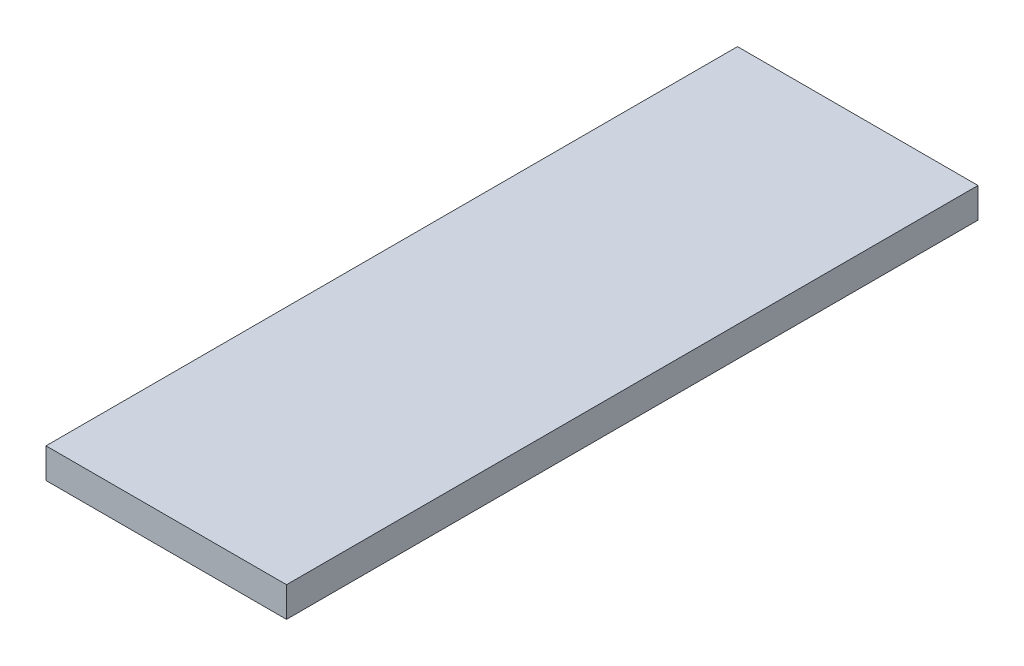
ISO-10303-21;
HEADER;
FILE_DESCRIPTION(('STEP AP214'),'2;1');
FILE_NAME('part.step','',(''),(''),'','','');
FILE_SCHEMA(('AUTOMOTIVE_DESIGN { 1 0 10303 214 1 1 1 1 }'));
ENDSEC;
DATA;
#1=APPLICATION_CONTEXT('core data for automotive mechanical design processes');
#2=APPLICATION_PROTOCOL_DEFINITION('international standard','automotive_design',2000,#1);
#3=PRODUCT_CONTEXT('',#1,'mechanical');
#4=PRODUCT('Part','Part','',(#3));
#5=PRODUCT_RELATED_PRODUCT_CATEGORY('part','',(#4));
#6=PRODUCT_DEFINITION_FORMATION('','',#4);
#7=PRODUCT_DEFINITION_CONTEXT('part definition',#1,'design');
#8=PRODUCT_DEFINITION('design','',#6,#7);
#9=PRODUCT_DEFINITION_SHAPE('','',#8);
#10=(LENGTH_UNIT() NAMED_UNIT(*) SI_UNIT(.MILLI.,.METRE.));
#11=(NAMED_UNIT(*) PLANE_ANGLE_UNIT() SI_UNIT($,.RADIAN.));
#12=(NAMED_UNIT(*) SI_UNIT($,.STERADIAN.) SOLID_ANGLE_UNIT());
#13=UNCERTAINTY_MEASURE_WITH_UNIT(LENGTH_MEASURE(1.E-05),#10,'distance_accuracy_value','');
#14=(GEOMETRIC_REPRESENTATION_CONTEXT(3) GLOBAL_UNCERTAINTY_ASSIGNED_CONTEXT((#13)) GLOBAL_UNIT_ASSIGNED_CONTEXT((#10,
#11,#12)) REPRESENTATION_CONTEXT('',''));
#15=CARTESIAN_POINT('',(0.,0.,0.));
#16=DIRECTION('',(0.,0.,1.));
#17=DIRECTION('',(1.,0.,0.));
#18=AXIS2_PLACEMENT_3D('',#15,#16,#17);
#19=CARTESIAN_POINT('',(0.,6.34999999999999,1.11022302462516E-13));
#20=DIRECTION('',(1.,0.,0.));
#21=DIRECTION('',(0.,0.,-1.));
#22=AXIS2_PLACEMENT_3D('',#19,#20,#21);
#23=PLANE('',#22);
#24=DIRECTION('',(0.,0.,1.));
#25=VECTOR('',#24,1.);
#26=CARTESIAN_POINT('',(0.,0.,0.));
#27=LINE('',#26,#25);
#28=CARTESIAN_POINT('',(0.,0.,-304.8));
#29=VERTEX_POINT('',#28);
#30=CARTESIAN_POINT('',(0.,0.,-158.75));
#31=VERTEX_POINT('',#30);
#32=EDGE_CURVE('E99',#29,#31,#27,.T.);
#33=ORIENTED_EDGE('',*,*,#32,.T.);
#34=DIRECTION('',(0.,1.,0.));
#35=VECTOR('',#34,1.);
#36=CARTESIAN_POINT('',(0.,0.,-158.75));
#37=LINE('',#36,#35);
#38=CARTESIAN_POINT('',(0.,6.34999999999999,-158.75));
#39=VERTEX_POINT('',#38);
#40=EDGE_CURVE('E48',#31,#39,#37,.T.);
#41=ORIENTED_EDGE('',*,*,#40,.T.);
#42=DIRECTION('',(0.,0.,1.));
#43=VECTOR('',#42,1.);
#44=CARTESIAN_POINT('',(0.,6.34999999999999,1.11022302462516E-13));
#45=LINE('',#44,#43);
#46=CARTESIAN_POINT('',(0.,6.35000000000002,-304.800000000001));
#47=VERTEX_POINT('',#46);
#48=EDGE_CURVE('E101',#47,#39,#45,.T.);
#49=ORIENTED_EDGE('',*,*,#48,.F.);
#50=DIRECTION('',(0.,-1.,0.));
#51=VECTOR('',#50,1.);
#52=CARTESIAN_POINT('',(0.,6.35000000000002,-304.800000000001));
#53=LINE('',#52,#51);
#54=EDGE_CURVE('E11',#47,#29,#53,.T.);
#55=ORIENTED_EDGE('',*,*,#54,.T.);
#56=EDGE_LOOP('',(#33,#41,#49,#55));
#57=FACE_BOUND('',#56,.T.);
#58=ADVANCED_FACE('F34',(#57),#23,.F.);
#59=CARTESIAN_POINT('',(0.,6.35000000000002,-304.800000000001));
#60=DIRECTION('',(0.,0.,1.));
#61=DIRECTION('',(1.,0.,0.));
#62=AXIS2_PLACEMENT_3D('',#59,#60,#61);
#63=PLANE('',#62);
#64=DIRECTION('',(-1.,0.,0.));
#65=VECTOR('',#64,1.);
#66=CARTESIAN_POINT('',(0.,6.35000000000002,-304.800000000001));
#67=LINE('',#66,#65);
#68=CARTESIAN_POINT('',(50.8,6.34999999999994,-304.800000000001));
#69=VERTEX_POINT('',#68);
#70=EDGE_CURVE('E41',#69,#47,#67,.T.);
#71=ORIENTED_EDGE('',*,*,#70,.F.);
#72=DIRECTION('',(0.,1.,0.));
#73=VECTOR('',#72,1.);
#74=CARTESIAN_POINT('',(50.8,0.,-304.8));
#75=LINE('',#74,#73);
#76=CARTESIAN_POINT('',(50.8,0.,-304.8));
#77=VERTEX_POINT('',#76);
#78=EDGE_CURVE('E97',#77,#69,#75,.T.);
#79=ORIENTED_EDGE('',*,*,#78,.F.);
#80=DIRECTION('',(-1.,0.,0.));
#81=VECTOR('',#80,1.);
#82=CARTESIAN_POINT('',(0.,0.,-304.8));
#83=LINE('',#82,#81);
#84=EDGE_CURVE('E91',#77,#29,#83,.T.);
#85=ORIENTED_EDGE('',*,*,#84,.T.);
#86=ORIENTED_EDGE('',*,*,#54,.F.);
#87=EDGE_LOOP('',(#71,#79,#85,#86));
#88=FACE_BOUND('',#87,.T.);
#89=ADVANCED_FACE('F105',(#88),#63,.F.);
#90=CARTESIAN_POINT('',(0.,6.34999999999999,1.11022302462516E-13));
#91=DIRECTION('',(0.,-1.,0.));
#92=DIRECTION('',(0.,0.,-1.));
#93=AXIS2_PLACEMENT_3D('',#90,#91,#92);
#94=PLANE('',#93);
#95=DIRECTION('',(-1.,0.,0.));
#96=VECTOR('',#95,1.);
#97=CARTESIAN_POINT('',(50.8,6.34999999999994,-158.75));
#98=LINE('',#97,#96);
#99=CARTESIAN_POINT('',(50.8,6.34999999999994,-158.75));
#100=VERTEX_POINT('',#99);
#101=EDGE_CURVE('E92',#100,#39,#98,.T.);
#102=ORIENTED_EDGE('',*,*,#101,.F.);
#103=DIRECTION('',(0.,0.,1.));
#104=VECTOR('',#103,1.);
#105=CARTESIAN_POINT('',(50.8,6.34999999999994,-304.800000000001));
#106=LINE('',#105,#104);
#107=EDGE_CURVE('E80',#69,#100,#106,.T.);
#108=ORIENTED_EDGE('',*,*,#107,.F.);
#109=ORIENTED_EDGE('',*,*,#70,.T.);
#110=ORIENTED_EDGE('',*,*,#48,.T.);
#111=EDGE_LOOP('',(#102,#108,#109,#110));
#112=FACE_BOUND('',#111,.T.);
#113=ADVANCED_FACE('F108',(#112),#94,.F.);
#114=CARTESIAN_POINT('',(0.,0.,0.));
#115=DIRECTION('',(0.,-1.,0.));
#116=DIRECTION('',(0.,0.,-1.));
#117=AXIS2_PLACEMENT_3D('',#114,#115,#116);
#118=PLANE('',#117);
#119=DIRECTION('',(0.,0.,1.));
#120=VECTOR('',#119,1.);
#121=CARTESIAN_POINT('',(50.8,0.,-304.8));
#122=LINE('',#121,#120);
#123=CARTESIAN_POINT('',(50.8,0.,-158.75));
#124=VERTEX_POINT('',#123);
#125=EDGE_CURVE('E78',#77,#124,#122,.T.);
#126=ORIENTED_EDGE('',*,*,#125,.T.);
#127=DIRECTION('',(-1.,0.,0.));
#128=VECTOR('',#127,1.);
#129=CARTESIAN_POINT('',(50.8,0.,-158.75));
#130=LINE('',#129,#128);
#131=EDGE_CURVE('E82',#124,#31,#130,.T.);
#132=ORIENTED_EDGE('',*,*,#131,.T.);
#133=ORIENTED_EDGE('',*,*,#32,.F.);
#134=ORIENTED_EDGE('',*,*,#84,.F.);
#135=EDGE_LOOP('',(#126,#132,#133,#134));
#136=FACE_BOUND('',#135,.T.);
#137=ADVANCED_FACE('F90',(#136),#118,.T.);
#138=CARTESIAN_POINT('',(50.8,0.,-304.8));
#139=DIRECTION('',(-1.,0.,0.));
#140=DIRECTION('',(0.,0.,1.));
#141=AXIS2_PLACEMENT_3D('',#138,#139,#140);
#142=PLANE('',#141);
#143=ORIENTED_EDGE('',*,*,#107,.T.);
#144=DIRECTION('',(0.,1.,0.));
#145=VECTOR('',#144,1.);
#146=CARTESIAN_POINT('',(50.8,0.,-158.75));
#147=LINE('',#146,#145);
#148=EDGE_CURVE('E75',#124,#100,#147,.T.);
#149=ORIENTED_EDGE('',*,*,#148,.F.);
#150=ORIENTED_EDGE('',*,*,#125,.F.);
#151=ORIENTED_EDGE('',*,*,#78,.T.);
#152=EDGE_LOOP('',(#143,#149,#150,#151));
#153=FACE_BOUND('',#152,.T.);
#154=ADVANCED_FACE('F76',(#153),#142,.F.);
#155=CARTESIAN_POINT('',(50.8,0.,-158.75));
#156=DIRECTION('',(0.,0.,-1.));
#157=DIRECTION('',(-1.,0.,0.));
#158=AXIS2_PLACEMENT_3D('',#155,#156,#157);
#159=PLANE('',#158);
#160=ORIENTED_EDGE('',*,*,#101,.T.);
#161=ORIENTED_EDGE('',*,*,#40,.F.);
#162=ORIENTED_EDGE('',*,*,#131,.F.);
#163=ORIENTED_EDGE('',*,*,#148,.T.);
#164=EDGE_LOOP('',(#160,#161,#162,#163));
#165=FACE_BOUND('',#164,.T.);
#166=ADVANCED_FACE('F84',(#165),#159,.F.);
#167=CLOSED_SHELL('',(#58,#89,#113,#137,#154,#166));
#168=MANIFOLD_SOLID_BREP('B2',#167);
#169=ADVANCED_BREP_SHAPE_REPRESENTATION('',(#18,#168),#14);
#170=SHAPE_DEFINITION_REPRESENTATION(#9,#169);
ENDSEC;
END-ISO-10303-21;
